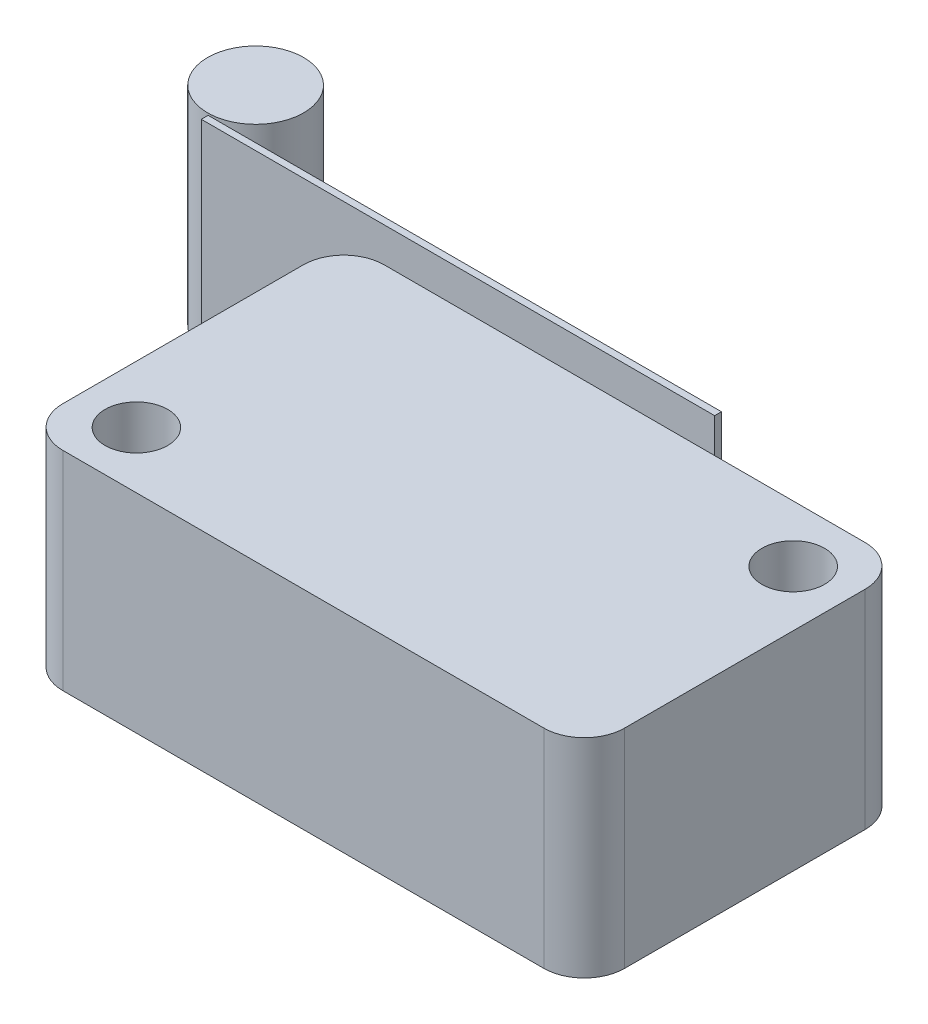
ISO-10303-21;
HEADER;
FILE_DESCRIPTION(('STEP AP214'),'2;1');
FILE_NAME('part.step','',(''),(''),'','','');
FILE_SCHEMA(('AUTOMOTIVE_DESIGN { 1 0 10303 214 1 1 1 1 }'));
ENDSEC;
DATA;
#1=APPLICATION_CONTEXT('core data for automotive mechanical design processes');
#2=APPLICATION_PROTOCOL_DEFINITION('international standard','automotive_design',2000,#1);
#3=PRODUCT_CONTEXT('',#1,'mechanical');
#4=PRODUCT('Part','Part','',(#3));
#5=PRODUCT_RELATED_PRODUCT_CATEGORY('part','',(#4));
#6=PRODUCT_DEFINITION_FORMATION('','',#4);
#7=PRODUCT_DEFINITION_CONTEXT('part definition',#1,'design');
#8=PRODUCT_DEFINITION('design','',#6,#7);
#9=PRODUCT_DEFINITION_SHAPE('','',#8);
#10=(LENGTH_UNIT() NAMED_UNIT(*) SI_UNIT(.MILLI.,.METRE.));
#11=(NAMED_UNIT(*) PLANE_ANGLE_UNIT() SI_UNIT($,.RADIAN.));
#12=(NAMED_UNIT(*) SI_UNIT($,.STERADIAN.) SOLID_ANGLE_UNIT());
#13=UNCERTAINTY_MEASURE_WITH_UNIT(LENGTH_MEASURE(1.E-05),#10,'distance_accuracy_value','');
#14=(GEOMETRIC_REPRESENTATION_CONTEXT(3) GLOBAL_UNCERTAINTY_ASSIGNED_CONTEXT((#13)) GLOBAL_UNIT_ASSIGNED_CONTEXT((#10,
#11,#12)) REPRESENTATION_CONTEXT('',''));
#15=CARTESIAN_POINT('',(0.,0.,0.));
#16=DIRECTION('',(0.,0.,1.));
#17=DIRECTION('',(1.,0.,0.));
#18=AXIS2_PLACEMENT_3D('',#15,#16,#17);
#19=CARTESIAN_POINT('',(-23.2572376509628,10.3,-12.7417127303503));
#20=DIRECTION('',(0.,-1.,0.));
#21=DIRECTION('',(0.,0.,-1.));
#22=AXIS2_PLACEMENT_3D('',#19,#20,#21);
#23=CYLINDRICAL_SURFACE('',#22,2.375);
#24=CARTESIAN_POINT('',(-23.2572376509628,10.3,-12.7417127303503));
#25=DIRECTION('',(0.,-1.,0.));
#26=DIRECTION('',(0.,0.,-1.));
#27=AXIS2_PLACEMENT_3D('',#24,#25,#26);
#28=CIRCLE('',#27,2.375);
#29=CARTESIAN_POINT('',(-23.2572376509628,10.3,-15.1167127303503));
#30=VERTEX_POINT('',#29);
#31=EDGE_CURVE('E11',#30,#30,#28,.T.);
#32=CARTESIAN_POINT('',(-23.2572376509628,0.,-12.7417127303503));
#33=DIRECTION('',(0.,-1.,0.));
#34=DIRECTION('',(0.,0.,-1.));
#35=AXIS2_PLACEMENT_3D('',#32,#33,#34);
#36=CIRCLE('',#35,2.375);
#37=CARTESIAN_POINT('',(-23.2572376509628,0.,-15.1167127303503));
#38=VERTEX_POINT('',#37);
#39=EDGE_CURVE('E45',#38,#38,#36,.T.);
#40=CARTESIAN_POINT('',(-23.2572376509628,10.3,-15.1167127303503));
#41=CARTESIAN_POINT('',(-23.2572376509628,10.1927083333333,-15.1167127303503));
#42=CARTESIAN_POINT('',(-23.2572376509628,10.0854166666667,-15.1167127303503));
#43=CARTESIAN_POINT('',(-23.2572376509628,9.87083333333333,-15.1167127303503));
#44=CARTESIAN_POINT('',(-23.2572376509628,9.76354166666667,-15.1167127303503));
#45=CARTESIAN_POINT('',(-23.2572376509628,9.54895833333333,-15.1167127303503));
#46=CARTESIAN_POINT('',(-23.2572376509628,9.44166666666667,-15.1167127303503));
#47=CARTESIAN_POINT('',(-23.2572376509628,9.22708333333333,-15.1167127303503));
#48=CARTESIAN_POINT('',(-23.2572376509628,9.11979166666667,-15.1167127303503));
#49=CARTESIAN_POINT('',(-23.2572376509628,8.90520833333333,-15.1167127303503));
#50=CARTESIAN_POINT('',(-23.2572376509628,8.79791666666667,-15.1167127303503));
#51=CARTESIAN_POINT('',(-23.2572376509628,8.58333333333333,-15.1167127303503));
#52=CARTESIAN_POINT('',(-23.2572376509628,8.47604166666667,-15.1167127303503));
#53=CARTESIAN_POINT('',(-23.2572376509628,8.26145833333333,-15.1167127303503));
#54=CARTESIAN_POINT('',(-23.2572376509628,8.15416666666667,-15.1167127303503));
#55=CARTESIAN_POINT('',(-23.2572376509628,7.93958333333333,-15.1167127303503));
#56=CARTESIAN_POINT('',(-23.2572376509628,7.83229166666667,-15.1167127303503));
#57=CARTESIAN_POINT('',(-23.2572376509628,7.61770833333333,-15.1167127303503));
#58=CARTESIAN_POINT('',(-23.2572376509628,7.51041666666667,-15.1167127303503));
#59=CARTESIAN_POINT('',(-23.2572376509628,7.29583333333333,-15.1167127303503));
#60=CARTESIAN_POINT('',(-23.2572376509628,7.18854166666667,-15.1167127303503));
#61=CARTESIAN_POINT('',(-23.2572376509628,6.97395833333333,-15.1167127303503));
#62=CARTESIAN_POINT('',(-23.2572376509628,6.86666666666667,-15.1167127303503));
#63=CARTESIAN_POINT('',(-23.2572376509628,6.65208333333333,-15.1167127303503));
#64=CARTESIAN_POINT('',(-23.2572376509628,6.54479166666667,-15.1167127303503));
#65=CARTESIAN_POINT('',(-23.2572376509628,6.33020833333333,-15.1167127303503));
#66=CARTESIAN_POINT('',(-23.2572376509628,6.22291666666667,-15.1167127303503));
#67=CARTESIAN_POINT('',(-23.2572376509628,6.00833333333334,-15.1167127303503));
#68=CARTESIAN_POINT('',(-23.2572376509628,5.90104166666667,-15.1167127303503));
#69=CARTESIAN_POINT('',(-23.2572376509628,5.68645833333334,-15.1167127303503));
#70=CARTESIAN_POINT('',(-23.2572376509628,5.57916666666667,-15.1167127303503));
#71=CARTESIAN_POINT('',(-23.2572376509628,5.36458333333333,-15.1167127303503));
#72=CARTESIAN_POINT('',(-23.2572376509628,5.25729166666667,-15.1167127303503));
#73=CARTESIAN_POINT('',(-23.2572376509628,5.04270833333333,-15.1167127303503));
#74=CARTESIAN_POINT('',(-23.2572376509628,4.93541666666667,-15.1167127303503));
#75=CARTESIAN_POINT('',(-23.2572376509628,4.72083333333333,-15.1167127303503));
#76=CARTESIAN_POINT('',(-23.2572376509628,4.61354166666667,-15.1167127303503));
#77=CARTESIAN_POINT('',(-23.2572376509628,4.39895833333333,-15.1167127303503));
#78=CARTESIAN_POINT('',(-23.2572376509628,4.29166666666667,-15.1167127303503));
#79=CARTESIAN_POINT('',(-23.2572376509628,4.07708333333333,-15.1167127303503));
#80=CARTESIAN_POINT('',(-23.2572376509628,3.96979166666667,-15.1167127303503));
#81=CARTESIAN_POINT('',(-23.2572376509628,3.75520833333333,-15.1167127303503));
#82=CARTESIAN_POINT('',(-23.2572376509628,3.64791666666667,-15.1167127303503));
#83=CARTESIAN_POINT('',(-23.2572376509628,3.43333333333334,-15.1167127303503));
#84=CARTESIAN_POINT('',(-23.2572376509628,3.32604166666667,-15.1167127303503));
#85=CARTESIAN_POINT('',(-23.2572376509628,3.11145833333334,-15.1167127303503));
#86=CARTESIAN_POINT('',(-23.2572376509628,3.00416666666667,-15.1167127303503));
#87=CARTESIAN_POINT('',(-23.2572376509628,2.78958333333334,-15.1167127303503));
#88=CARTESIAN_POINT('',(-23.2572376509628,2.68229166666667,-15.1167127303503));
#89=CARTESIAN_POINT('',(-23.2572376509628,2.46770833333334,-15.1167127303503));
#90=CARTESIAN_POINT('',(-23.2572376509628,2.36041666666667,-15.1167127303503));
#91=CARTESIAN_POINT('',(-23.2572376509628,2.14583333333334,-15.1167127303503));
#92=CARTESIAN_POINT('',(-23.2572376509628,2.03854166666667,-15.1167127303503));
#93=CARTESIAN_POINT('',(-23.2572376509628,1.82395833333334,-15.1167127303503));
#94=CARTESIAN_POINT('',(-23.2572376509628,1.71666666666667,-15.1167127303503));
#95=CARTESIAN_POINT('',(-23.2572376509628,1.50208333333333,-15.1167127303503));
#96=CARTESIAN_POINT('',(-23.2572376509628,1.39479166666667,-15.1167127303503));
#97=CARTESIAN_POINT('',(-23.2572376509628,1.18020833333334,-15.1167127303503));
#98=CARTESIAN_POINT('',(-23.2572376509628,1.07291666666667,-15.1167127303503));
#99=CARTESIAN_POINT('',(-23.2572376509628,0.858333333333335,-15.1167127303503));
#100=CARTESIAN_POINT('',(-23.2572376509628,0.751041666666668,-15.1167127303503));
#101=CARTESIAN_POINT('',(-23.2572376509628,0.536458333333335,-15.1167127303503));
#102=CARTESIAN_POINT('',(-23.2572376509628,0.429166666666668,-15.1167127303503));
#103=CARTESIAN_POINT('',(-23.2572376509628,0.214583333333335,-15.1167127303503));
#104=CARTESIAN_POINT('',(-23.2572376509628,0.107291666666668,-15.1167127303503));
#105=CARTESIAN_POINT('',(-23.2572376509628,0.,-15.1167127303503));
#106=B_SPLINE_CURVE_WITH_KNOTS('',3,(#40,#41,#42,#43,#44,#45,#46,#47,#48,#49,#50,#51,#52,#53,
#54,#55,#56,#57,#58,#59,#60,#61,#62,#63,#64,#65,#66,#67,#68,#69,#70,#71,#72,#73,#74,#75,#76,#77,
#78,#79,#80,#81,#82,#83,#84,#85,#86,#87,#88,#89,#90,#91,#92,#93,#94,#95,#96,#97,#98,#99,#100,
#101,#102,#103,#104,#105),.UNSPECIFIED.,.F.,.F.,(4,2,2,2,2,2,2,2,2,2,2,2,2,2,2,2,2,2,2,2,2,2,2,
2,2,2,2,2,2,2,2,2,4),(0.,0.321874999999999,0.643749999999998,0.965625,1.2875,1.609375,1.93125,
2.253125,2.575,2.896875,3.21875,3.540625,3.8625,4.184375,4.50625,4.828125,5.15,5.471875,5.79375,
6.115625,6.4375,6.759375,7.08125,7.403125,7.725,8.046875,8.36875,8.690625,9.0125,9.334375,
9.65625,9.978125,10.3),.UNSPECIFIED.);
#107=EDGE_CURVE('BSEAM42',#30,#38,#106,.T.);
#108=ORIENTED_EDGE('',*,*,#31,.T.);
#109=ORIENTED_EDGE('',*,*,#39,.F.);
#110=ORIENTED_EDGE('',*,*,#107,.T.);
#111=ORIENTED_EDGE('',*,*,#107,.F.);
#112=EDGE_LOOP('',(#108,#110,#109,#111));
#113=FACE_BOUND('',#112,.T.);
#114=ADVANCED_FACE('F42',(#113),#23,.T.);
#115=CARTESIAN_POINT('',(-23.2572376509628,10.3,-12.7417127303503));
#116=DIRECTION('',(0.,-1.,0.));
#117=DIRECTION('',(0.,0.,-1.));
#118=AXIS2_PLACEMENT_3D('',#115,#116,#117);
#119=PLANE('',#118);
#120=ORIENTED_EDGE('',*,*,#31,.F.);
#121=EDGE_LOOP('',(#120));
#122=FACE_BOUND('',#121,.T.);
#123=ADVANCED_FACE('F57',(#122),#119,.F.);
#124=CARTESIAN_POINT('',(-23.2572376509628,0.,-12.7417127303503));
#125=DIRECTION('',(0.,-1.,0.));
#126=DIRECTION('',(0.,0.,-1.));
#127=AXIS2_PLACEMENT_3D('',#124,#125,#126);
#128=PLANE('',#127);
#129=ORIENTED_EDGE('',*,*,#39,.T.);
#130=EDGE_LOOP('',(#129));
#131=FACE_BOUND('',#130,.T.);
#132=ADVANCED_FACE('F54',(#131),#128,.T.);
#133=CLOSED_SHELL('',(#114,#123,#132));
#134=MANIFOLD_SOLID_BREP('B2',#133);
#135=CARTESIAN_POINT('',(2.26206034407408,0.,-10.2726795566521));
#136=DIRECTION('',(1.,0.,0.));
#137=DIRECTION('',(0.,0.,-1.));
#138=AXIS2_PLACEMENT_3D('',#135,#136,#137);
#139=PLANE('',#138);
#140=DIRECTION('',(0.,0.,-1.));
#141=VECTOR('',#140,1.);
#142=CARTESIAN_POINT('',(2.26206034407408,10.3,-10.2726795566521));
#143=LINE('',#142,#141);
#144=CARTESIAN_POINT('',(2.26206034407408,10.3,-9.93558409916194));
#145=VERTEX_POINT('',#144);
#146=CARTESIAN_POINT('',(2.26206034407408,10.3,-10.2726795566521));
#147=VERTEX_POINT('',#146);
#148=EDGE_CURVE('E156',#145,#147,#143,.T.);
#149=ORIENTED_EDGE('',*,*,#148,.F.);
#150=DIRECTION('',(0.,1.,0.));
#151=VECTOR('',#150,1.);
#152=CARTESIAN_POINT('',(2.26206034407408,0.,-9.93558409916194));
#153=LINE('',#152,#151);
#154=CARTESIAN_POINT('',(2.26206034407408,0.,-9.93558409916194));
#155=VERTEX_POINT('',#154);
#156=EDGE_CURVE('E40',#155,#145,#153,.T.);
#157=ORIENTED_EDGE('',*,*,#156,.F.);
#158=DIRECTION('',(0.,0.,-1.));
#159=VECTOR('',#158,1.);
#160=CARTESIAN_POINT('',(2.26206034407408,0.,-10.2726795566521));
#161=LINE('',#160,#159);
#162=CARTESIAN_POINT('',(2.26206034407408,0.,-10.2726795566521));
#163=VERTEX_POINT('',#162);
#164=EDGE_CURVE('E150',#155,#163,#161,.T.);
#165=ORIENTED_EDGE('',*,*,#164,.T.);
#166=DIRECTION('',(0.,1.,0.));
#167=VECTOR('',#166,1.);
#168=CARTESIAN_POINT('',(2.26206034407408,0.,-10.2726795566521));
#169=LINE('',#168,#167);
#170=EDGE_CURVE('E95',#163,#147,#169,.T.);
#171=ORIENTED_EDGE('',*,*,#170,.T.);
#172=EDGE_LOOP('',(#149,#157,#165,#171));
#173=FACE_BOUND('',#172,.T.);
#174=ADVANCED_FACE('F92',(#173),#139,.T.);
#175=CARTESIAN_POINT('',(2.26206034407408,0.,-9.93558409916194));
#176=DIRECTION('',(0.,0.,1.));
#177=DIRECTION('',(1.,0.,0.));
#178=AXIS2_PLACEMENT_3D('',#175,#176,#177);
#179=PLANE('',#178);
#180=DIRECTION('',(1.,0.,0.));
#181=VECTOR('',#180,1.);
#182=CARTESIAN_POINT('',(2.26206034407408,10.3,-9.93558409916194));
#183=LINE('',#182,#181);
#184=CARTESIAN_POINT('',(-23.1379396559259,10.3,-9.93558409916194));
#185=VERTEX_POINT('',#184);
#186=EDGE_CURVE('E152',#185,#145,#183,.T.);
#187=ORIENTED_EDGE('',*,*,#186,.F.);
#188=DIRECTION('',(0.,1.,0.));
#189=VECTOR('',#188,1.);
#190=CARTESIAN_POINT('',(-23.1379396559259,0.,-9.93558409916194));
#191=LINE('',#190,#189);
#192=CARTESIAN_POINT('',(-23.1379396559259,0.,-9.93558409916194));
#193=VERTEX_POINT('',#192);
#194=EDGE_CURVE('E101',#193,#185,#191,.T.);
#195=ORIENTED_EDGE('',*,*,#194,.F.);
#196=DIRECTION('',(1.,0.,0.));
#197=VECTOR('',#196,1.);
#198=CARTESIAN_POINT('',(2.26206034407408,0.,-9.93558409916194));
#199=LINE('',#198,#197);
#200=EDGE_CURVE('E147',#193,#155,#199,.T.);
#201=ORIENTED_EDGE('',*,*,#200,.T.);
#202=ORIENTED_EDGE('',*,*,#156,.T.);
#203=EDGE_LOOP('',(#187,#195,#201,#202));
#204=FACE_BOUND('',#203,.T.);
#205=ADVANCED_FACE('F166',(#204),#179,.T.);
#206=CARTESIAN_POINT('',(-23.1379396559259,0.,-9.93558409916194));
#207=DIRECTION('',(-1.,0.,0.));
#208=DIRECTION('',(0.,0.,1.));
#209=AXIS2_PLACEMENT_3D('',#206,#207,#208);
#210=PLANE('',#209);
#211=DIRECTION('',(0.,0.,1.));
#212=VECTOR('',#211,1.);
#213=CARTESIAN_POINT('',(-23.1379396559259,10.3,-9.93558409916194));
#214=LINE('',#213,#212);
#215=CARTESIAN_POINT('',(-23.1379396559259,10.3,-10.2726795566521));
#216=VERTEX_POINT('',#215);
#217=EDGE_CURVE('E142',#216,#185,#214,.T.);
#218=ORIENTED_EDGE('',*,*,#217,.F.);
#219=DIRECTION('',(0.,1.,0.));
#220=VECTOR('',#219,1.);
#221=CARTESIAN_POINT('',(-23.1379396559259,0.,-10.2726795566521));
#222=LINE('',#221,#220);
#223=CARTESIAN_POINT('',(-23.1379396559259,0.,-10.2726795566521));
#224=VERTEX_POINT('',#223);
#225=EDGE_CURVE('E137',#224,#216,#222,.T.);
#226=ORIENTED_EDGE('',*,*,#225,.F.);
#227=DIRECTION('',(0.,0.,1.));
#228=VECTOR('',#227,1.);
#229=CARTESIAN_POINT('',(-23.1379396559259,0.,-9.93558409916194));
#230=LINE('',#229,#228);
#231=EDGE_CURVE('E140',#224,#193,#230,.T.);
#232=ORIENTED_EDGE('',*,*,#231,.T.);
#233=ORIENTED_EDGE('',*,*,#194,.T.);
#234=EDGE_LOOP('',(#218,#226,#232,#233));
#235=FACE_BOUND('',#234,.T.);
#236=ADVANCED_FACE('F139',(#235),#210,.T.);
#237=CARTESIAN_POINT('',(-23.1379396559259,0.,-10.2726795566521));
#238=DIRECTION('',(0.,0.,-1.));
#239=DIRECTION('',(-1.,0.,0.));
#240=AXIS2_PLACEMENT_3D('',#237,#238,#239);
#241=PLANE('',#240);
#242=DIRECTION('',(-1.,0.,0.));
#243=VECTOR('',#242,1.);
#244=CARTESIAN_POINT('',(-23.1379396559259,10.3,-10.2726795566521));
#245=LINE('',#244,#243);
#246=EDGE_CURVE('E159',#147,#216,#245,.T.);
#247=ORIENTED_EDGE('',*,*,#246,.F.);
#248=ORIENTED_EDGE('',*,*,#170,.F.);
#249=DIRECTION('',(-1.,0.,0.));
#250=VECTOR('',#249,1.);
#251=CARTESIAN_POINT('',(-23.1379396559259,0.,-10.2726795566521));
#252=LINE('',#251,#250);
#253=EDGE_CURVE('E146',#163,#224,#252,.T.);
#254=ORIENTED_EDGE('',*,*,#253,.T.);
#255=ORIENTED_EDGE('',*,*,#225,.T.);
#256=EDGE_LOOP('',(#247,#248,#254,#255));
#257=FACE_BOUND('',#256,.T.);
#258=ADVANCED_FACE('F149',(#257),#241,.T.);
#259=CARTESIAN_POINT('',(0.,0.,0.));
#260=DIRECTION('',(0.,-1.,0.));
#261=DIRECTION('',(0.,0.,-1.));
#262=AXIS2_PLACEMENT_3D('',#259,#260,#261);
#263=PLANE('',#262);
#264=ORIENTED_EDGE('',*,*,#164,.F.);
#265=ORIENTED_EDGE('',*,*,#200,.F.);
#266=ORIENTED_EDGE('',*,*,#231,.F.);
#267=ORIENTED_EDGE('',*,*,#253,.F.);
#268=EDGE_LOOP('',(#264,#265,#266,#267));
#269=FACE_BOUND('',#268,.T.);
#270=ADVANCED_FACE('F145',(#269),#263,.T.);
#271=CARTESIAN_POINT('',(0.,10.3,0.));
#272=DIRECTION('',(0.,-1.,0.));
#273=DIRECTION('',(0.,0.,-1.));
#274=AXIS2_PLACEMENT_3D('',#271,#272,#273);
#275=PLANE('',#274);
#276=ORIENTED_EDGE('',*,*,#148,.T.);
#277=ORIENTED_EDGE('',*,*,#246,.T.);
#278=ORIENTED_EDGE('',*,*,#217,.T.);
#279=ORIENTED_EDGE('',*,*,#186,.T.);
#280=EDGE_LOOP('',(#276,#277,#278,#279));
#281=FACE_BOUND('',#280,.T.);
#282=ADVANCED_FACE('F165',(#281),#275,.F.);
#283=CLOSED_SHELL('',(#174,#205,#236,#258,#270,#282));
#284=MANIFOLD_SOLID_BREP('B6',#283);
#285=CARTESIAN_POINT('',(0.,10.3,0.));
#286=DIRECTION('',(0.,1.,0.));
#287=DIRECTION('',(0.,0.,1.));
#288=AXIS2_PLACEMENT_3D('',#285,#286,#287);
#289=PLANE('',#288);
#290=CARTESIAN_POINT('',(10.6620603440741,10.3,-5.42310483826591));
#291=DIRECTION('',(0.,1.,0.));
#292=DIRECTION('',(0.,0.,1.));
#293=AXIS2_PLACEMENT_3D('',#290,#291,#292);
#294=CIRCLE('',#293,1.55);
#295=CARTESIAN_POINT('',(10.6620603440741,10.3,-6.97310483826591));
#296=VERTEX_POINT('',#295);
#297=EDGE_CURVE('E361',#296,#296,#294,.T.);
#298=ORIENTED_EDGE('',*,*,#297,.F.);
#299=EDGE_LOOP('',(#298));
#300=FACE_BOUND('',#299,.T.);
#301=DIRECTION('',(1.,0.,0.));
#302=VECTOR('',#301,1.);
#303=CARTESIAN_POINT('',(13.4224959431577,10.3,7.67689516173409));
#304=LINE('',#303,#302);
#305=CARTESIAN_POINT('',(-12.3775040568423,10.3,7.67689516173409));
#306=VERTEX_POINT('',#305);
#307=CARTESIAN_POINT('',(11.4224959431577,10.3,7.67689516173409));
#308=VERTEX_POINT('',#307);
#309=EDGE_CURVE('E352',#306,#308,#304,.T.);
#310=ORIENTED_EDGE('',*,*,#309,.T.);
#311=CARTESIAN_POINT('',(11.4224959431577,10.3,5.67689516173409));
#312=DIRECTION('',(0.,1.,0.));
#313=DIRECTION('',(0.,0.,1.));
#314=AXIS2_PLACEMENT_3D('',#311,#312,#313);
#315=CIRCLE('',#314,2.);
#316=CARTESIAN_POINT('',(13.4224959431577,10.3,5.67689516173409));
#317=VERTEX_POINT('',#316);
#318=EDGE_CURVE('E330',#308,#317,#315,.T.);
#319=ORIENTED_EDGE('',*,*,#318,.T.);
#320=DIRECTION('',(0.,0.,-1.));
#321=VECTOR('',#320,1.);
#322=CARTESIAN_POINT('',(13.4224959431577,10.3,7.67689516173409));
#323=LINE('',#322,#321);
#324=CARTESIAN_POINT('',(13.4224959431577,10.3,-6.22310483826591));
#325=VERTEX_POINT('',#324);
#326=EDGE_CURVE('E300',#317,#325,#323,.T.);
#327=ORIENTED_EDGE('',*,*,#326,.T.);
#328=CARTESIAN_POINT('',(11.4224959431577,10.3,-6.22310483826591));
#329=DIRECTION('',(0.,1.,0.));
#330=DIRECTION('',(0.,0.,1.));
#331=AXIS2_PLACEMENT_3D('',#328,#329,#330);
#332=CIRCLE('',#331,2.);
#333=CARTESIAN_POINT('',(11.4224959431577,10.3,-8.22310483826591));
#334=VERTEX_POINT('',#333);
#335=EDGE_CURVE('E236',#325,#334,#332,.T.);
#336=ORIENTED_EDGE('',*,*,#335,.T.);
#337=DIRECTION('',(-1.,0.,0.));
#338=VECTOR('',#337,1.);
#339=CARTESIAN_POINT('',(13.4224959431577,10.3,-8.22310483826591));
#340=LINE('',#339,#338);
#341=CARTESIAN_POINT('',(-12.3775040568423,10.3,-8.22310483826591));
#342=VERTEX_POINT('',#341);
#343=EDGE_CURVE('E316',#334,#342,#340,.T.);
#344=ORIENTED_EDGE('',*,*,#343,.T.);
#345=CARTESIAN_POINT('',(-12.3775040568423,10.3,-6.22310483826591));
#346=DIRECTION('',(0.,1.,0.));
#347=DIRECTION('',(0.,0.,1.));
#348=AXIS2_PLACEMENT_3D('',#345,#346,#347);
#349=CIRCLE('',#348,2.);
#350=CARTESIAN_POINT('',(-14.3775040568423,10.3,-6.22310483826591));
#351=VERTEX_POINT('',#350);
#352=EDGE_CURVE('E326',#342,#351,#349,.T.);
#353=ORIENTED_EDGE('',*,*,#352,.T.);
#354=DIRECTION('',(0.,0.,1.));
#355=VECTOR('',#354,1.);
#356=CARTESIAN_POINT('',(-14.3775040568423,10.3,7.67689516173409));
#357=LINE('',#356,#355);
#358=CARTESIAN_POINT('',(-14.3775040568423,10.3,5.67689516173409));
#359=VERTEX_POINT('',#358);
#360=EDGE_CURVE('E310',#351,#359,#357,.T.);
#361=ORIENTED_EDGE('',*,*,#360,.T.);
#362=CARTESIAN_POINT('',(-12.3775040568423,10.3,5.67689516173409));
#363=DIRECTION('',(0.,1.,0.));
#364=DIRECTION('',(0.,0.,1.));
#365=AXIS2_PLACEMENT_3D('',#362,#363,#364);
#366=CIRCLE('',#365,2.);
#367=EDGE_CURVE('E328',#359,#306,#366,.T.);
#368=ORIENTED_EDGE('',*,*,#367,.T.);
#369=EDGE_LOOP('',(#310,#319,#327,#336,#344,#353,#361,#368));
#370=FACE_BOUND('',#369,.T.);
#371=CARTESIAN_POINT('',(-11.5379396559259,10.3,4.87689516173409));
#372=DIRECTION('',(0.,1.,0.));
#373=DIRECTION('',(0.,0.,1.));
#374=AXIS2_PLACEMENT_3D('',#371,#372,#373);
#375=CIRCLE('',#374,1.55);
#376=CARTESIAN_POINT('',(-11.5379396559259,10.3,3.32689516173409));
#377=VERTEX_POINT('',#376);
#378=EDGE_CURVE('E366',#377,#377,#375,.T.);
#379=ORIENTED_EDGE('',*,*,#378,.F.);
#380=EDGE_LOOP('',(#379));
#381=FACE_BOUND('',#380,.T.);
#382=ADVANCED_FACE('F216',(#300,#370,#381),#289,.T.);
#383=CARTESIAN_POINT('',(0.,0.,0.));
#384=DIRECTION('',(0.,1.,0.));
#385=DIRECTION('',(0.,0.,1.));
#386=AXIS2_PLACEMENT_3D('',#383,#384,#385);
#387=PLANE('',#386);
#388=DIRECTION('',(0.,0.,-1.));
#389=VECTOR('',#388,1.);
#390=CARTESIAN_POINT('',(13.4224959431577,0.,7.67689516173409));
#391=LINE('',#390,#389);
#392=CARTESIAN_POINT('',(13.4224959431577,0.,5.67689516173409));
#393=VERTEX_POINT('',#392);
#394=CARTESIAN_POINT('',(13.4224959431577,0.,-6.22310483826591));
#395=VERTEX_POINT('',#394);
#396=EDGE_CURVE('E298',#393,#395,#391,.T.);
#397=ORIENTED_EDGE('',*,*,#396,.F.);
#398=CARTESIAN_POINT('',(11.4224959431577,0.,5.67689516173409));
#399=DIRECTION('',(0.,1.,0.));
#400=DIRECTION('',(0.,0.,1.));
#401=AXIS2_PLACEMENT_3D('',#398,#399,#400);
#402=CIRCLE('',#401,2.);
#403=CARTESIAN_POINT('',(11.4224959431577,0.,7.67689516173409));
#404=VERTEX_POINT('',#403);
#405=EDGE_CURVE('E281',#393,#404,#402,.F.);
#406=ORIENTED_EDGE('',*,*,#405,.T.);
#407=DIRECTION('',(1.,0.,0.));
#408=VECTOR('',#407,1.);
#409=CARTESIAN_POINT('',(13.4224959431577,0.,7.67689516173409));
#410=LINE('',#409,#408);
#411=CARTESIAN_POINT('',(-12.3775040568423,0.,7.67689516173409));
#412=VERTEX_POINT('',#411);
#413=EDGE_CURVE('E308',#412,#404,#410,.T.);
#414=ORIENTED_EDGE('',*,*,#413,.F.);
#415=CARTESIAN_POINT('',(-12.3775040568423,0.,5.67689516173409));
#416=DIRECTION('',(0.,1.,0.));
#417=DIRECTION('',(0.,0.,1.));
#418=AXIS2_PLACEMENT_3D('',#415,#416,#417);
#419=CIRCLE('',#418,2.);
#420=CARTESIAN_POINT('',(-14.3775040568423,0.,5.67689516173409));
#421=VERTEX_POINT('',#420);
#422=EDGE_CURVE('E292',#412,#421,#419,.F.);
#423=ORIENTED_EDGE('',*,*,#422,.T.);
#424=DIRECTION('',(0.,0.,1.));
#425=VECTOR('',#424,1.);
#426=CARTESIAN_POINT('',(-14.3775040568423,0.,7.67689516173409));
#427=LINE('',#426,#425);
#428=CARTESIAN_POINT('',(-14.3775040568423,0.,-6.22310483826591));
#429=VERTEX_POINT('',#428);
#430=EDGE_CURVE('E312',#429,#421,#427,.T.);
#431=ORIENTED_EDGE('',*,*,#430,.F.);
#432=CARTESIAN_POINT('',(-12.3775040568423,0.,-6.22310483826591));
#433=DIRECTION('',(0.,1.,0.));
#434=DIRECTION('',(0.,0.,1.));
#435=AXIS2_PLACEMENT_3D('',#432,#433,#434);
#436=CIRCLE('',#435,2.);
#437=CARTESIAN_POINT('',(-12.3775040568423,0.,-8.22310483826591));
#438=VERTEX_POINT('',#437);
#439=EDGE_CURVE('E319',#429,#438,#436,.F.);
#440=ORIENTED_EDGE('',*,*,#439,.T.);
#441=DIRECTION('',(-1.,0.,0.));
#442=VECTOR('',#441,1.);
#443=CARTESIAN_POINT('',(13.4224959431577,0.,-8.22310483826591));
#444=LINE('',#443,#442);
#445=CARTESIAN_POINT('',(11.4224959431577,0.,-8.22310483826591));
#446=VERTEX_POINT('',#445);
#447=EDGE_CURVE('E307',#446,#438,#444,.T.);
#448=ORIENTED_EDGE('',*,*,#447,.F.);
#449=CARTESIAN_POINT('',(11.4224959431577,0.,-6.22310483826591));
#450=DIRECTION('',(0.,1.,0.));
#451=DIRECTION('',(0.,0.,1.));
#452=AXIS2_PLACEMENT_3D('',#449,#450,#451);
#453=CIRCLE('',#452,2.);
#454=EDGE_CURVE('E301',#446,#395,#453,.F.);
#455=ORIENTED_EDGE('',*,*,#454,.T.);
#456=EDGE_LOOP('',(#397,#406,#414,#423,#431,#440,#448,#455));
#457=FACE_BOUND('',#456,.T.);
#458=CARTESIAN_POINT('',(10.6620603440741,0.,-5.42310483826591));
#459=DIRECTION('',(0.,1.,0.));
#460=DIRECTION('',(0.,0.,1.));
#461=AXIS2_PLACEMENT_3D('',#458,#459,#460);
#462=CIRCLE('',#461,1.55);
#463=CARTESIAN_POINT('',(10.6620603440741,0.,-6.97310483826591));
#464=VERTEX_POINT('',#463);
#465=EDGE_CURVE('E357',#464,#464,#462,.T.);
#466=ORIENTED_EDGE('',*,*,#465,.T.);
#467=EDGE_LOOP('',(#466));
#468=FACE_BOUND('',#467,.T.);
#469=CARTESIAN_POINT('',(-11.5379396559259,0.,4.87689516173409));
#470=DIRECTION('',(0.,1.,0.));
#471=DIRECTION('',(0.,0.,1.));
#472=AXIS2_PLACEMENT_3D('',#469,#470,#471);
#473=CIRCLE('',#472,1.55);
#474=CARTESIAN_POINT('',(-11.5379396559259,0.,3.32689516173409));
#475=VERTEX_POINT('',#474);
#476=EDGE_CURVE('E368',#475,#475,#473,.T.);
#477=ORIENTED_EDGE('',*,*,#476,.T.);
#478=EDGE_LOOP('',(#477));
#479=FACE_BOUND('',#478,.T.);
#480=ADVANCED_FACE('F304',(#457,#468,#479),#387,.F.);
#481=CARTESIAN_POINT('',(-14.3775040568423,10.3,7.67689516173409));
#482=DIRECTION('',(1.,0.,0.));
#483=DIRECTION('',(0.,0.,-1.));
#484=AXIS2_PLACEMENT_3D('',#481,#482,#483);
#485=PLANE('',#484);
#486=ORIENTED_EDGE('',*,*,#430,.T.);
#487=DIRECTION('',(0.,-1.,0.));
#488=VECTOR('',#487,1.);
#489=CARTESIAN_POINT('',(-14.3775040568423,10.3,5.67689516173409));
#490=LINE('',#489,#488);
#491=EDGE_CURVE('E335',#421,#359,#490,.F.);
#492=ORIENTED_EDGE('',*,*,#491,.T.);
#493=ORIENTED_EDGE('',*,*,#360,.F.);
#494=DIRECTION('',(0.,-1.,0.));
#495=VECTOR('',#494,1.);
#496=CARTESIAN_POINT('',(-14.3775040568423,10.3,-6.22310483826591));
#497=LINE('',#496,#495);
#498=EDGE_CURVE('E332',#351,#429,#497,.T.);
#499=ORIENTED_EDGE('',*,*,#498,.T.);
#500=EDGE_LOOP('',(#486,#492,#493,#499));
#501=FACE_BOUND('',#500,.T.);
#502=ADVANCED_FACE('F348',(#501),#485,.F.);
#503=CARTESIAN_POINT('',(13.4224959431577,10.3,7.67689516173409));
#504=DIRECTION('',(0.,0.,-1.));
#505=DIRECTION('',(-1.,0.,0.));
#506=AXIS2_PLACEMENT_3D('',#503,#504,#505);
#507=PLANE('',#506);
#508=ORIENTED_EDGE('',*,*,#413,.T.);
#509=DIRECTION('',(0.,-1.,0.));
#510=VECTOR('',#509,1.);
#511=CARTESIAN_POINT('',(11.4224959431577,10.3,7.67689516173409));
#512=LINE('',#511,#510);
#513=EDGE_CURVE('E286',#404,#308,#512,.F.);
#514=ORIENTED_EDGE('',*,*,#513,.T.);
#515=ORIENTED_EDGE('',*,*,#309,.F.);
#516=DIRECTION('',(0.,-1.,0.));
#517=VECTOR('',#516,1.);
#518=CARTESIAN_POINT('',(-12.3775040568423,10.3,7.67689516173409));
#519=LINE('',#518,#517);
#520=EDGE_CURVE('E291',#306,#412,#519,.T.);
#521=ORIENTED_EDGE('',*,*,#520,.T.);
#522=EDGE_LOOP('',(#508,#514,#515,#521));
#523=FACE_BOUND('',#522,.T.);
#524=ADVANCED_FACE('F392',(#523),#507,.F.);
#525=CARTESIAN_POINT('',(13.4224959431577,10.3,7.67689516173409));
#526=DIRECTION('',(-1.,0.,0.));
#527=DIRECTION('',(0.,0.,1.));
#528=AXIS2_PLACEMENT_3D('',#525,#526,#527);
#529=PLANE('',#528);
#530=ORIENTED_EDGE('',*,*,#326,.F.);
#531=DIRECTION('',(0.,-1.,0.));
#532=VECTOR('',#531,1.);
#533=CARTESIAN_POINT('',(13.4224959431577,10.3,5.67689516173409));
#534=LINE('',#533,#532);
#535=EDGE_CURVE('E285',#317,#393,#534,.T.);
#536=ORIENTED_EDGE('',*,*,#535,.T.);
#537=ORIENTED_EDGE('',*,*,#396,.T.);
#538=DIRECTION('',(0.,-1.,0.));
#539=VECTOR('',#538,1.);
#540=CARTESIAN_POINT('',(13.4224959431577,10.3,-6.22310483826591));
#541=LINE('',#540,#539);
#542=EDGE_CURVE('E302',#395,#325,#541,.F.);
#543=ORIENTED_EDGE('',*,*,#542,.T.);
#544=EDGE_LOOP('',(#530,#536,#537,#543));
#545=FACE_BOUND('',#544,.T.);
#546=ADVANCED_FACE('F297',(#545),#529,.F.);
#547=CARTESIAN_POINT('',(13.4224959431577,10.3,-8.22310483826591));
#548=DIRECTION('',(0.,0.,1.));
#549=DIRECTION('',(1.,0.,0.));
#550=AXIS2_PLACEMENT_3D('',#547,#548,#549);
#551=PLANE('',#550);
#552=ORIENTED_EDGE('',*,*,#447,.T.);
#553=DIRECTION('',(0.,-1.,0.));
#554=VECTOR('',#553,1.);
#555=CARTESIAN_POINT('',(-12.3775040568423,10.3,-8.22310483826591));
#556=LINE('',#555,#554);
#557=EDGE_CURVE('E90',#438,#342,#556,.F.);
#558=ORIENTED_EDGE('',*,*,#557,.T.);
#559=ORIENTED_EDGE('',*,*,#343,.F.);
#560=DIRECTION('',(0.,-1.,0.));
#561=VECTOR('',#560,1.);
#562=CARTESIAN_POINT('',(11.4224959431577,10.3,-8.22310483826591));
#563=LINE('',#562,#561);
#564=EDGE_CURVE('E224',#334,#446,#563,.T.);
#565=ORIENTED_EDGE('',*,*,#564,.T.);
#566=EDGE_LOOP('',(#552,#558,#559,#565));
#567=FACE_BOUND('',#566,.T.);
#568=ADVANCED_FACE('F338',(#567),#551,.F.);
#569=CARTESIAN_POINT('',(10.6620603440741,10.3,-5.42310483826591));
#570=DIRECTION('',(0.,-1.,0.));
#571=DIRECTION('',(0.,0.,-1.));
#572=AXIS2_PLACEMENT_3D('',#569,#570,#571);
#573=CYLINDRICAL_SURFACE('',#572,1.55);
#574=CARTESIAN_POINT('',(10.6620603440741,10.3,-6.97310483826591));
#575=CARTESIAN_POINT('',(10.6620603440741,10.1927083333333,-6.97310483826591));
#576=CARTESIAN_POINT('',(10.6620603440741,10.0854166666667,-6.97310483826591));
#577=CARTESIAN_POINT('',(10.6620603440741,9.87083333333333,-6.97310483826591));
#578=CARTESIAN_POINT('',(10.6620603440741,9.76354166666667,-6.97310483826591));
#579=CARTESIAN_POINT('',(10.6620603440741,9.54895833333333,-6.97310483826591));
#580=CARTESIAN_POINT('',(10.6620603440741,9.44166666666667,-6.97310483826591));
#581=CARTESIAN_POINT('',(10.6620603440741,9.22708333333333,-6.97310483826591));
#582=CARTESIAN_POINT('',(10.6620603440741,9.11979166666667,-6.97310483826591));
#583=CARTESIAN_POINT('',(10.6620603440741,8.90520833333333,-6.97310483826591));
#584=CARTESIAN_POINT('',(10.6620603440741,8.79791666666667,-6.97310483826591));
#585=CARTESIAN_POINT('',(10.6620603440741,8.58333333333333,-6.97310483826591));
#586=CARTESIAN_POINT('',(10.6620603440741,8.47604166666667,-6.97310483826591));
#587=CARTESIAN_POINT('',(10.6620603440741,8.26145833333333,-6.97310483826591));
#588=CARTESIAN_POINT('',(10.6620603440741,8.15416666666667,-6.97310483826591));
#589=CARTESIAN_POINT('',(10.6620603440741,7.93958333333333,-6.97310483826591));
#590=CARTESIAN_POINT('',(10.6620603440741,7.83229166666667,-6.97310483826591));
#591=CARTESIAN_POINT('',(10.6620603440741,7.61770833333333,-6.97310483826591));
#592=CARTESIAN_POINT('',(10.6620603440741,7.51041666666667,-6.97310483826591));
#593=CARTESIAN_POINT('',(10.6620603440741,7.29583333333333,-6.97310483826591));
#594=CARTESIAN_POINT('',(10.6620603440741,7.18854166666666,-6.97310483826591));
#595=CARTESIAN_POINT('',(10.6620603440741,6.97395833333333,-6.97310483826591));
#596=CARTESIAN_POINT('',(10.6620603440741,6.86666666666667,-6.97310483826591));
#597=CARTESIAN_POINT('',(10.6620603440741,6.65208333333333,-6.97310483826591));
#598=CARTESIAN_POINT('',(10.6620603440741,6.54479166666667,-6.97310483826591));
#599=CARTESIAN_POINT('',(10.6620603440741,6.33020833333333,-6.97310483826591));
#600=CARTESIAN_POINT('',(10.6620603440741,6.22291666666667,-6.97310483826591));
#601=CARTESIAN_POINT('',(10.6620603440741,6.00833333333333,-6.97310483826591));
#602=CARTESIAN_POINT('',(10.6620603440741,5.90104166666667,-6.97310483826591));
#603=CARTESIAN_POINT('',(10.6620603440741,5.68645833333333,-6.97310483826591));
#604=CARTESIAN_POINT('',(10.6620603440741,5.57916666666667,-6.97310483826591));
#605=CARTESIAN_POINT('',(10.6620603440741,5.36458333333333,-6.97310483826591));
#606=CARTESIAN_POINT('',(10.6620603440741,5.25729166666667,-6.97310483826591));
#607=CARTESIAN_POINT('',(10.6620603440741,5.04270833333333,-6.97310483826591));
#608=CARTESIAN_POINT('',(10.6620603440741,4.93541666666667,-6.97310483826591));
#609=CARTESIAN_POINT('',(10.6620603440741,4.72083333333333,-6.97310483826591));
#610=CARTESIAN_POINT('',(10.6620603440741,4.61354166666666,-6.97310483826591));
#611=CARTESIAN_POINT('',(10.6620603440741,4.39895833333333,-6.97310483826591));
#612=CARTESIAN_POINT('',(10.6620603440741,4.29166666666667,-6.97310483826591));
#613=CARTESIAN_POINT('',(10.6620603440741,4.07708333333333,-6.97310483826591));
#614=CARTESIAN_POINT('',(10.6620603440741,3.96979166666666,-6.97310483826591));
#615=CARTESIAN_POINT('',(10.6620603440741,3.75520833333333,-6.97310483826591));
#616=CARTESIAN_POINT('',(10.6620603440741,3.64791666666666,-6.97310483826591));
#617=CARTESIAN_POINT('',(10.6620603440741,3.43333333333333,-6.97310483826591));
#618=CARTESIAN_POINT('',(10.6620603440741,3.32604166666666,-6.97310483826591));
#619=CARTESIAN_POINT('',(10.6620603440741,3.11145833333333,-6.97310483826591));
#620=CARTESIAN_POINT('',(10.6620603440741,3.00416666666666,-6.97310483826591));
#621=CARTESIAN_POINT('',(10.6620603440741,2.78958333333333,-6.97310483826591));
#622=CARTESIAN_POINT('',(10.6620603440741,2.68229166666666,-6.97310483826591));
#623=CARTESIAN_POINT('',(10.6620603440741,2.46770833333333,-6.97310483826591));
#624=CARTESIAN_POINT('',(10.6620603440741,2.36041666666667,-6.97310483826591));
#625=CARTESIAN_POINT('',(10.6620603440741,2.14583333333333,-6.97310483826591));
#626=CARTESIAN_POINT('',(10.6620603440741,2.03854166666667,-6.97310483826591));
#627=CARTESIAN_POINT('',(10.6620603440741,1.82395833333333,-6.97310483826591));
#628=CARTESIAN_POINT('',(10.6620603440741,1.71666666666667,-6.97310483826591));
#629=CARTESIAN_POINT('',(10.6620603440741,1.50208333333333,-6.97310483826591));
#630=CARTESIAN_POINT('',(10.6620603440741,1.39479166666667,-6.97310483826591));
#631=CARTESIAN_POINT('',(10.6620603440741,1.18020833333333,-6.97310483826591));
#632=CARTESIAN_POINT('',(10.6620603440741,1.07291666666667,-6.97310483826591));
#633=CARTESIAN_POINT('',(10.6620603440741,0.858333333333333,-6.97310483826591));
#634=CARTESIAN_POINT('',(10.6620603440741,0.751041666666665,-6.97310483826591));
#635=CARTESIAN_POINT('',(10.6620603440741,0.536458333333331,-6.97310483826591));
#636=CARTESIAN_POINT('',(10.6620603440741,0.429166666666664,-6.97310483826591));
#637=CARTESIAN_POINT('',(10.6620603440741,0.214583333333331,-6.97310483826591));
#638=CARTESIAN_POINT('',(10.6620603440741,0.107291666666665,-6.97310483826591));
#639=CARTESIAN_POINT('',(10.6620603440741,0.,-6.97310483826591));
#640=B_SPLINE_CURVE_WITH_KNOTS('',3,(#574,#575,#576,#577,#578,#579,#580,#581,#582,#583,#584,
#585,#586,#587,#588,#589,#590,#591,#592,#593,#594,#595,#596,#597,#598,#599,#600,#601,#602,#603,
#604,#605,#606,#607,#608,#609,#610,#611,#612,#613,#614,#615,#616,#617,#618,#619,#620,#621,#622,
#623,#624,#625,#626,#627,#628,#629,#630,#631,#632,#633,#634,#635,#636,#637,#638,#639),
.UNSPECIFIED.,.F.,.F.,(4,2,2,2,2,2,2,2,2,2,2,2,2,2,2,2,2,2,2,2,2,2,2,2,2,2,2,2,2,2,2,2,4),(0.,
0.321875000000001,0.64375,0.965625000000001,1.2875,1.609375,1.93125,2.253125,2.575,2.896875,
3.21875,3.540625,3.8625,4.184375,4.50625,4.828125,5.15,5.471875,5.79375,6.115625,6.4375,
6.759375,7.08125,7.403125,7.725,8.046875,8.36875,8.690625,9.0125,9.334375,9.65625,9.978125,
10.3),.UNSPECIFIED.);
#641=EDGE_CURVE('BSEAM385',#296,#464,#640,.T.);
#642=ORIENTED_EDGE('',*,*,#297,.T.);
#643=ORIENTED_EDGE('',*,*,#465,.F.);
#644=ORIENTED_EDGE('',*,*,#641,.T.);
#645=ORIENTED_EDGE('',*,*,#641,.F.);
#646=EDGE_LOOP('',(#642,#644,#643,#645));
#647=FACE_BOUND('',#646,.T.);
#648=ADVANCED_FACE('F385',(#647),#573,.F.);
#649=CARTESIAN_POINT('',(-11.5379396559259,10.3,4.87689516173409));
#650=DIRECTION('',(0.,-1.,0.));
#651=DIRECTION('',(0.,0.,-1.));
#652=AXIS2_PLACEMENT_3D('',#649,#650,#651);
#653=CYLINDRICAL_SURFACE('',#652,1.55);
#654=CARTESIAN_POINT('',(-11.5379396559259,10.3,3.32689516173409));
#655=CARTESIAN_POINT('',(-11.5379396559259,10.1927083333333,3.32689516173409));
#656=CARTESIAN_POINT('',(-11.5379396559259,10.0854166666667,3.32689516173409));
#657=CARTESIAN_POINT('',(-11.5379396559259,9.87083333333333,3.32689516173409));
#658=CARTESIAN_POINT('',(-11.5379396559259,9.76354166666667,3.32689516173409));
#659=CARTESIAN_POINT('',(-11.5379396559259,9.54895833333333,3.32689516173409));
#660=CARTESIAN_POINT('',(-11.5379396559259,9.44166666666667,3.32689516173409));
#661=CARTESIAN_POINT('',(-11.5379396559259,9.22708333333333,3.32689516173409));
#662=CARTESIAN_POINT('',(-11.5379396559259,9.11979166666667,3.32689516173409));
#663=CARTESIAN_POINT('',(-11.5379396559259,8.90520833333333,3.32689516173409));
#664=CARTESIAN_POINT('',(-11.5379396559259,8.79791666666667,3.32689516173409));
#665=CARTESIAN_POINT('',(-11.5379396559259,8.58333333333333,3.32689516173409));
#666=CARTESIAN_POINT('',(-11.5379396559259,8.47604166666667,3.32689516173409));
#667=CARTESIAN_POINT('',(-11.5379396559259,8.26145833333333,3.32689516173409));
#668=CARTESIAN_POINT('',(-11.5379396559259,8.15416666666667,3.32689516173409));
#669=CARTESIAN_POINT('',(-11.5379396559259,7.93958333333333,3.32689516173409));
#670=CARTESIAN_POINT('',(-11.5379396559259,7.83229166666667,3.32689516173409));
#671=CARTESIAN_POINT('',(-11.5379396559259,7.61770833333333,3.32689516173409));
#672=CARTESIAN_POINT('',(-11.5379396559259,7.51041666666667,3.32689516173409));
#673=CARTESIAN_POINT('',(-11.5379396559259,7.29583333333333,3.32689516173409));
#674=CARTESIAN_POINT('',(-11.5379396559259,7.18854166666666,3.32689516173409));
#675=CARTESIAN_POINT('',(-11.5379396559259,6.97395833333333,3.32689516173409));
#676=CARTESIAN_POINT('',(-11.5379396559259,6.86666666666667,3.32689516173409));
#677=CARTESIAN_POINT('',(-11.5379396559259,6.65208333333333,3.32689516173409));
#678=CARTESIAN_POINT('',(-11.5379396559259,6.54479166666667,3.32689516173409));
#679=CARTESIAN_POINT('',(-11.5379396559259,6.33020833333333,3.32689516173409));
#680=CARTESIAN_POINT('',(-11.5379396559259,6.22291666666667,3.32689516173409));
#681=CARTESIAN_POINT('',(-11.5379396559259,6.00833333333333,3.32689516173409));
#682=CARTESIAN_POINT('',(-11.5379396559259,5.90104166666667,3.32689516173409));
#683=CARTESIAN_POINT('',(-11.5379396559259,5.68645833333333,3.32689516173409));
#684=CARTESIAN_POINT('',(-11.5379396559259,5.57916666666667,3.32689516173409));
#685=CARTESIAN_POINT('',(-11.5379396559259,5.36458333333333,3.32689516173409));
#686=CARTESIAN_POINT('',(-11.5379396559259,5.25729166666667,3.32689516173409));
#687=CARTESIAN_POINT('',(-11.5379396559259,5.04270833333333,3.32689516173409));
#688=CARTESIAN_POINT('',(-11.5379396559259,4.93541666666667,3.32689516173409));
#689=CARTESIAN_POINT('',(-11.5379396559259,4.72083333333333,3.32689516173409));
#690=CARTESIAN_POINT('',(-11.5379396559259,4.61354166666666,3.32689516173409));
#691=CARTESIAN_POINT('',(-11.5379396559259,4.39895833333333,3.32689516173409));
#692=CARTESIAN_POINT('',(-11.5379396559259,4.29166666666667,3.32689516173409));
#693=CARTESIAN_POINT('',(-11.5379396559259,4.07708333333333,3.32689516173409));
#694=CARTESIAN_POINT('',(-11.5379396559259,3.96979166666666,3.32689516173409));
#695=CARTESIAN_POINT('',(-11.5379396559259,3.75520833333333,3.32689516173409));
#696=CARTESIAN_POINT('',(-11.5379396559259,3.64791666666666,3.32689516173409));
#697=CARTESIAN_POINT('',(-11.5379396559259,3.43333333333333,3.32689516173409));
#698=CARTESIAN_POINT('',(-11.5379396559259,3.32604166666666,3.32689516173409));
#699=CARTESIAN_POINT('',(-11.5379396559259,3.11145833333333,3.32689516173409));
#700=CARTESIAN_POINT('',(-11.5379396559259,3.00416666666666,3.32689516173409));
#701=CARTESIAN_POINT('',(-11.5379396559259,2.78958333333333,3.32689516173409));
#702=CARTESIAN_POINT('',(-11.5379396559259,2.68229166666666,3.32689516173409));
#703=CARTESIAN_POINT('',(-11.5379396559259,2.46770833333333,3.32689516173409));
#704=CARTESIAN_POINT('',(-11.5379396559259,2.36041666666667,3.32689516173409));
#705=CARTESIAN_POINT('',(-11.5379396559259,2.14583333333333,3.32689516173409));
#706=CARTESIAN_POINT('',(-11.5379396559259,2.03854166666667,3.32689516173409));
#707=CARTESIAN_POINT('',(-11.5379396559259,1.82395833333333,3.32689516173409));
#708=CARTESIAN_POINT('',(-11.5379396559259,1.71666666666667,3.32689516173409));
#709=CARTESIAN_POINT('',(-11.5379396559259,1.50208333333333,3.32689516173409));
#710=CARTESIAN_POINT('',(-11.5379396559259,1.39479166666667,3.32689516173409));
#711=CARTESIAN_POINT('',(-11.5379396559259,1.18020833333333,3.32689516173409));
#712=CARTESIAN_POINT('',(-11.5379396559259,1.07291666666667,3.32689516173409));
#713=CARTESIAN_POINT('',(-11.5379396559259,0.858333333333333,3.32689516173409));
#714=CARTESIAN_POINT('',(-11.5379396559259,0.751041666666665,3.32689516173409));
#715=CARTESIAN_POINT('',(-11.5379396559259,0.536458333333331,3.32689516173409));
#716=CARTESIAN_POINT('',(-11.5379396559259,0.429166666666664,3.32689516173409));
#717=CARTESIAN_POINT('',(-11.5379396559259,0.214583333333331,3.32689516173409));
#718=CARTESIAN_POINT('',(-11.5379396559259,0.107291666666665,3.32689516173409));
#719=CARTESIAN_POINT('',(-11.5379396559259,0.,3.32689516173409));
#720=B_SPLINE_CURVE_WITH_KNOTS('',3,(#654,#655,#656,#657,#658,#659,#660,#661,#662,#663,#664,
#665,#666,#667,#668,#669,#670,#671,#672,#673,#674,#675,#676,#677,#678,#679,#680,#681,#682,#683,
#684,#685,#686,#687,#688,#689,#690,#691,#692,#693,#694,#695,#696,#697,#698,#699,#700,#701,#702,
#703,#704,#705,#706,#707,#708,#709,#710,#711,#712,#713,#714,#715,#716,#717,#718,#719),
.UNSPECIFIED.,.F.,.F.,(4,2,2,2,2,2,2,2,2,2,2,2,2,2,2,2,2,2,2,2,2,2,2,2,2,2,2,2,2,2,2,2,4),(0.,
0.321875000000001,0.64375,0.965625000000001,1.2875,1.609375,1.93125,2.253125,2.575,2.896875,
3.21875,3.540625,3.8625,4.184375,4.50625,4.828125,5.15,5.471875,5.79375,6.115625,6.4375,
6.759375,7.08125,7.403125,7.725,8.046875,8.36875,8.690625,9.0125,9.334375,9.65625,9.978125,
10.3),.UNSPECIFIED.);
#721=EDGE_CURVE('BSEAM374',#377,#475,#720,.T.);
#722=ORIENTED_EDGE('',*,*,#378,.T.);
#723=ORIENTED_EDGE('',*,*,#476,.F.);
#724=ORIENTED_EDGE('',*,*,#721,.T.);
#725=ORIENTED_EDGE('',*,*,#721,.F.);
#726=EDGE_LOOP('',(#722,#724,#723,#725));
#727=FACE_BOUND('',#726,.T.);
#728=ADVANCED_FACE('F374',(#727),#653,.F.);
#729=CARTESIAN_POINT('',(11.4224959431577,10.3,5.67689516173409));
#730=DIRECTION('',(0.,-1.,0.));
#731=DIRECTION('',(0.,0.,-1.));
#732=AXIS2_PLACEMENT_3D('',#729,#730,#731);
#733=CYLINDRICAL_SURFACE('',#732,2.);
#734=ORIENTED_EDGE('',*,*,#318,.F.);
#735=ORIENTED_EDGE('',*,*,#513,.F.);
#736=ORIENTED_EDGE('',*,*,#405,.F.);
#737=ORIENTED_EDGE('',*,*,#535,.F.);
#738=EDGE_LOOP('',(#734,#735,#736,#737));
#739=FACE_BOUND('',#738,.T.);
#740=ADVANCED_FACE('F284',(#739),#733,.T.);
#741=CARTESIAN_POINT('',(-12.3775040568423,10.3,5.67689516173409));
#742=DIRECTION('',(0.,-1.,0.));
#743=DIRECTION('',(0.,0.,-1.));
#744=AXIS2_PLACEMENT_3D('',#741,#742,#743);
#745=CYLINDRICAL_SURFACE('',#744,2.);
#746=ORIENTED_EDGE('',*,*,#367,.F.);
#747=ORIENTED_EDGE('',*,*,#491,.F.);
#748=ORIENTED_EDGE('',*,*,#422,.F.);
#749=ORIENTED_EDGE('',*,*,#520,.F.);
#750=EDGE_LOOP('',(#746,#747,#748,#749));
#751=FACE_BOUND('',#750,.T.);
#752=ADVANCED_FACE('F400',(#751),#745,.T.);
#753=CARTESIAN_POINT('',(-12.3775040568423,10.3,-6.22310483826591));
#754=DIRECTION('',(0.,-1.,0.));
#755=DIRECTION('',(0.,0.,-1.));
#756=AXIS2_PLACEMENT_3D('',#753,#754,#755);
#757=CYLINDRICAL_SURFACE('',#756,2.);
#758=ORIENTED_EDGE('',*,*,#352,.F.);
#759=ORIENTED_EDGE('',*,*,#557,.F.);
#760=ORIENTED_EDGE('',*,*,#439,.F.);
#761=ORIENTED_EDGE('',*,*,#498,.F.);
#762=EDGE_LOOP('',(#758,#759,#760,#761));
#763=FACE_BOUND('',#762,.T.);
#764=ADVANCED_FACE('F345',(#763),#757,.T.);
#765=CARTESIAN_POINT('',(11.4224959431577,10.3,-6.22310483826591));
#766=DIRECTION('',(0.,-1.,0.));
#767=DIRECTION('',(0.,0.,-1.));
#768=AXIS2_PLACEMENT_3D('',#765,#766,#767);
#769=CYLINDRICAL_SURFACE('',#768,2.);
#770=ORIENTED_EDGE('',*,*,#335,.F.);
#771=ORIENTED_EDGE('',*,*,#542,.F.);
#772=ORIENTED_EDGE('',*,*,#454,.F.);
#773=ORIENTED_EDGE('',*,*,#564,.F.);
#774=EDGE_LOOP('',(#770,#771,#772,#773));
#775=FACE_BOUND('',#774,.T.);
#776=ADVANCED_FACE('F218',(#775),#769,.T.);
#777=CLOSED_SHELL('',(#382,#480,#502,#524,#546,#568,#648,#728,#740,#752,#764,#776));
#778=MANIFOLD_SOLID_BREP('B34',#777);
#779=ADVANCED_BREP_SHAPE_REPRESENTATION('',(#18,#134,#284,#778),#14);
#780=SHAPE_DEFINITION_REPRESENTATION(#9,#779);
ENDSEC;
END-ISO-10303-21;
